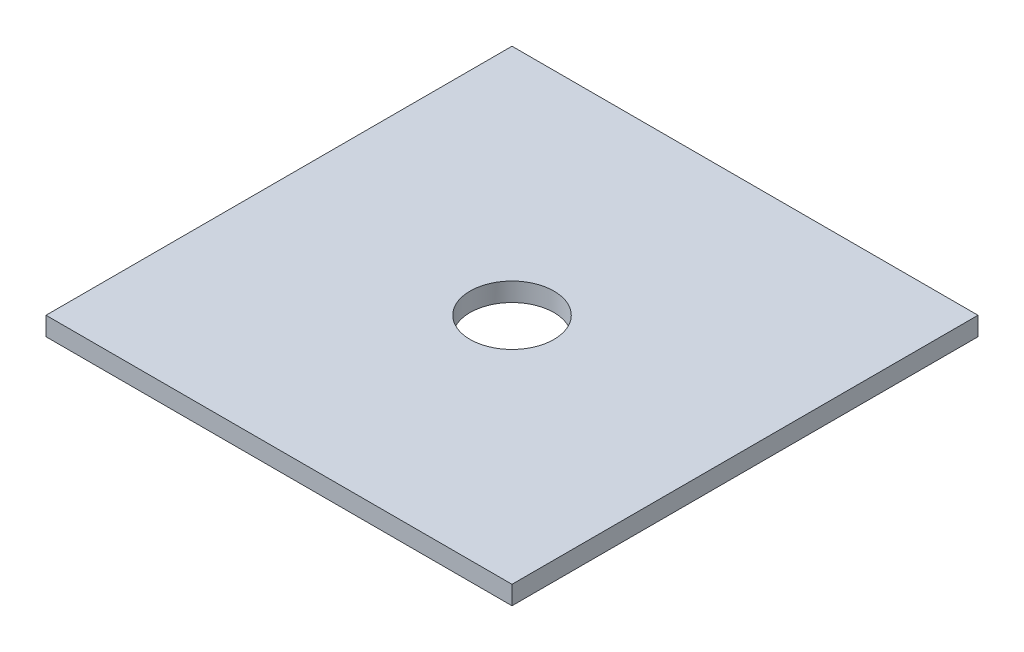
ISO-10303-21;
HEADER;
FILE_DESCRIPTION(('STEP AP214'),'2;1');
FILE_NAME('part.step','',(''),(''),'','','');
FILE_SCHEMA(('AUTOMOTIVE_DESIGN { 1 0 10303 214 1 1 1 1 }'));
ENDSEC;
DATA;
#1=APPLICATION_CONTEXT('core data for automotive mechanical design processes');
#2=APPLICATION_PROTOCOL_DEFINITION('international standard','automotive_design',2000,#1);
#3=PRODUCT_CONTEXT('',#1,'mechanical');
#4=PRODUCT('Part','Part','',(#3));
#5=PRODUCT_RELATED_PRODUCT_CATEGORY('part','',(#4));
#6=PRODUCT_DEFINITION_FORMATION('','',#4);
#7=PRODUCT_DEFINITION_CONTEXT('part definition',#1,'design');
#8=PRODUCT_DEFINITION('design','',#6,#7);
#9=PRODUCT_DEFINITION_SHAPE('','',#8);
#10=(LENGTH_UNIT() NAMED_UNIT(*) SI_UNIT(.MILLI.,.METRE.));
#11=(NAMED_UNIT(*) PLANE_ANGLE_UNIT() SI_UNIT($,.RADIAN.));
#12=(NAMED_UNIT(*) SI_UNIT($,.STERADIAN.) SOLID_ANGLE_UNIT());
#13=UNCERTAINTY_MEASURE_WITH_UNIT(LENGTH_MEASURE(1.E-05),#10,'distance_accuracy_value','');
#14=(GEOMETRIC_REPRESENTATION_CONTEXT(3) GLOBAL_UNCERTAINTY_ASSIGNED_CONTEXT((#13)) GLOBAL_UNIT_ASSIGNED_CONTEXT((#10,
#11,#12)) REPRESENTATION_CONTEXT('',''));
#15=CARTESIAN_POINT('',(0.,0.,0.));
#16=DIRECTION('',(0.,0.,1.));
#17=DIRECTION('',(1.,0.,0.));
#18=AXIS2_PLACEMENT_3D('',#15,#16,#17);
#19=CARTESIAN_POINT('',(-25.,2.,-25.));
#20=DIRECTION('',(1.,0.,0.));
#21=DIRECTION('',(0.,0.,-1.));
#22=AXIS2_PLACEMENT_3D('',#19,#20,#21);
#23=PLANE('',#22);
#24=DIRECTION('',(0.,0.,1.));
#25=VECTOR('',#24,1.);
#26=CARTESIAN_POINT('',(-25.,0.,-25.));
#27=LINE('',#26,#25);
#28=CARTESIAN_POINT('',(-25.,0.,-25.));
#29=VERTEX_POINT('',#28);
#30=CARTESIAN_POINT('',(-25.,0.,25.));
#31=VERTEX_POINT('',#30);
#32=EDGE_CURVE('E98',#29,#31,#27,.T.);
#33=ORIENTED_EDGE('',*,*,#32,.T.);
#34=DIRECTION('',(0.,-1.,0.));
#35=VECTOR('',#34,1.);
#36=CARTESIAN_POINT('',(-25.,2.,25.));
#37=LINE('',#36,#35);
#38=CARTESIAN_POINT('',(-25.,2.,25.));
#39=VERTEX_POINT('',#38);
#40=EDGE_CURVE('E11',#39,#31,#37,.T.);
#41=ORIENTED_EDGE('',*,*,#40,.F.);
#42=DIRECTION('',(0.,0.,1.));
#43=VECTOR('',#42,1.);
#44=CARTESIAN_POINT('',(-25.,2.,-25.));
#45=LINE('',#44,#43);
#46=CARTESIAN_POINT('',(-25.,2.,-25.));
#47=VERTEX_POINT('',#46);
#48=EDGE_CURVE('E86',#47,#39,#45,.T.);
#49=ORIENTED_EDGE('',*,*,#48,.F.);
#50=DIRECTION('',(0.,-1.,0.));
#51=VECTOR('',#50,1.);
#52=CARTESIAN_POINT('',(-25.,2.,-25.));
#53=LINE('',#52,#51);
#54=EDGE_CURVE('E94',#47,#29,#53,.T.);
#55=ORIENTED_EDGE('',*,*,#54,.T.);
#56=EDGE_LOOP('',(#33,#41,#49,#55));
#57=FACE_BOUND('',#56,.T.);
#58=ADVANCED_FACE('F35',(#57),#23,.F.);
#59=CARTESIAN_POINT('',(25.,2.,25.));
#60=DIRECTION('',(0.,0.,-1.));
#61=DIRECTION('',(-1.,0.,0.));
#62=AXIS2_PLACEMENT_3D('',#59,#60,#61);
#63=PLANE('',#62);
#64=DIRECTION('',(1.,0.,0.));
#65=VECTOR('',#64,1.);
#66=CARTESIAN_POINT('',(25.,0.,25.));
#67=LINE('',#66,#65);
#68=CARTESIAN_POINT('',(25.,0.,25.));
#69=VERTEX_POINT('',#68);
#70=EDGE_CURVE('E90',#31,#69,#67,.T.);
#71=ORIENTED_EDGE('',*,*,#70,.T.);
#72=DIRECTION('',(0.,-1.,0.));
#73=VECTOR('',#72,1.);
#74=CARTESIAN_POINT('',(25.,2.,25.));
#75=LINE('',#74,#73);
#76=CARTESIAN_POINT('',(25.,2.,25.));
#77=VERTEX_POINT('',#76);
#78=EDGE_CURVE('E43',#77,#69,#75,.T.);
#79=ORIENTED_EDGE('',*,*,#78,.F.);
#80=DIRECTION('',(1.,0.,0.));
#81=VECTOR('',#80,1.);
#82=CARTESIAN_POINT('',(25.,2.,25.));
#83=LINE('',#82,#81);
#84=EDGE_CURVE('E81',#39,#77,#83,.T.);
#85=ORIENTED_EDGE('',*,*,#84,.F.);
#86=ORIENTED_EDGE('',*,*,#40,.T.);
#87=EDGE_LOOP('',(#71,#79,#85,#86));
#88=FACE_BOUND('',#87,.T.);
#89=ADVANCED_FACE('F89',(#88),#63,.F.);
#90=CARTESIAN_POINT('',(25.,2.,-25.));
#91=DIRECTION('',(-1.,0.,0.));
#92=DIRECTION('',(0.,0.,1.));
#93=AXIS2_PLACEMENT_3D('',#90,#91,#92);
#94=PLANE('',#93);
#95=DIRECTION('',(0.,0.,-1.));
#96=VECTOR('',#95,1.);
#97=CARTESIAN_POINT('',(25.,0.,-25.));
#98=LINE('',#97,#96);
#99=CARTESIAN_POINT('',(25.,0.,-25.));
#100=VERTEX_POINT('',#99);
#101=EDGE_CURVE('E68',#69,#100,#98,.T.);
#102=ORIENTED_EDGE('',*,*,#101,.T.);
#103=DIRECTION('',(0.,-1.,0.));
#104=VECTOR('',#103,1.);
#105=CARTESIAN_POINT('',(25.,2.,-25.));
#106=LINE('',#105,#104);
#107=CARTESIAN_POINT('',(25.,2.,-25.));
#108=VERTEX_POINT('',#107);
#109=EDGE_CURVE('E91',#108,#100,#106,.T.);
#110=ORIENTED_EDGE('',*,*,#109,.F.);
#111=DIRECTION('',(0.,0.,-1.));
#112=VECTOR('',#111,1.);
#113=CARTESIAN_POINT('',(25.,2.,-25.));
#114=LINE('',#113,#112);
#115=EDGE_CURVE('E84',#77,#108,#114,.T.);
#116=ORIENTED_EDGE('',*,*,#115,.F.);
#117=ORIENTED_EDGE('',*,*,#78,.T.);
#118=EDGE_LOOP('',(#102,#110,#116,#117));
#119=FACE_BOUND('',#118,.T.);
#120=ADVANCED_FACE('F92',(#119),#94,.F.);
#121=CARTESIAN_POINT('',(25.,2.,-25.));
#122=DIRECTION('',(0.,0.,1.));
#123=DIRECTION('',(1.,0.,0.));
#124=AXIS2_PLACEMENT_3D('',#121,#122,#123);
#125=PLANE('',#124);
#126=DIRECTION('',(-1.,0.,0.));
#127=VECTOR('',#126,1.);
#128=CARTESIAN_POINT('',(25.,0.,-25.));
#129=LINE('',#128,#127);
#130=EDGE_CURVE('E74',#100,#29,#129,.T.);
#131=ORIENTED_EDGE('',*,*,#130,.T.);
#132=ORIENTED_EDGE('',*,*,#54,.F.);
#133=DIRECTION('',(-1.,0.,0.));
#134=VECTOR('',#133,1.);
#135=CARTESIAN_POINT('',(25.,2.,-25.));
#136=LINE('',#135,#134);
#137=EDGE_CURVE('E51',#108,#47,#136,.T.);
#138=ORIENTED_EDGE('',*,*,#137,.F.);
#139=ORIENTED_EDGE('',*,*,#109,.T.);
#140=EDGE_LOOP('',(#131,#132,#138,#139));
#141=FACE_BOUND('',#140,.T.);
#142=ADVANCED_FACE('F106',(#141),#125,.F.);
#143=CARTESIAN_POINT('',(0.,2.,0.));
#144=DIRECTION('',(0.,-1.,0.));
#145=DIRECTION('',(0.,0.,-1.));
#146=AXIS2_PLACEMENT_3D('',#143,#144,#145);
#147=PLANE('',#146);
#148=CARTESIAN_POINT('',(0.,2.,0.));
#149=DIRECTION('',(0.,1.,0.));
#150=DIRECTION('',(0.,0.,1.));
#151=AXIS2_PLACEMENT_3D('',#148,#149,#150);
#152=CIRCLE('',#151,4.49999999999999);
#153=CARTESIAN_POINT('',(0.,2.,4.49999999999999));
#154=VERTEX_POINT('',#153);
#155=EDGE_CURVE('E114',#154,#154,#152,.T.);
#156=ORIENTED_EDGE('',*,*,#155,.F.);
#157=EDGE_LOOP('',(#156));
#158=FACE_BOUND('',#157,.T.);
#159=ORIENTED_EDGE('',*,*,#48,.T.);
#160=ORIENTED_EDGE('',*,*,#84,.T.);
#161=ORIENTED_EDGE('',*,*,#115,.T.);
#162=ORIENTED_EDGE('',*,*,#137,.T.);
#163=EDGE_LOOP('',(#159,#160,#161,#162));
#164=FACE_BOUND('',#163,.T.);
#165=ADVANCED_FACE('F82',(#158,#164),#147,.F.);
#166=CARTESIAN_POINT('',(0.,0.,0.));
#167=DIRECTION('',(0.,-1.,0.));
#168=DIRECTION('',(0.,0.,-1.));
#169=AXIS2_PLACEMENT_3D('',#166,#167,#168);
#170=PLANE('',#169);
#171=CARTESIAN_POINT('',(0.,0.,0.));
#172=DIRECTION('',(0.,-1.,0.));
#173=DIRECTION('',(0.,0.,-1.));
#174=AXIS2_PLACEMENT_3D('',#171,#172,#173);
#175=CIRCLE('',#174,4.49999999999999);
#176=CARTESIAN_POINT('',(0.,0.,-4.49999999999999));
#177=VERTEX_POINT('',#176);
#178=EDGE_CURVE('E101',#177,#177,#175,.T.);
#179=ORIENTED_EDGE('',*,*,#178,.F.);
#180=EDGE_LOOP('',(#179));
#181=FACE_BOUND('',#180,.T.);
#182=ORIENTED_EDGE('',*,*,#32,.F.);
#183=ORIENTED_EDGE('',*,*,#130,.F.);
#184=ORIENTED_EDGE('',*,*,#101,.F.);
#185=ORIENTED_EDGE('',*,*,#70,.F.);
#186=EDGE_LOOP('',(#182,#183,#184,#185));
#187=FACE_BOUND('',#186,.T.);
#188=ADVANCED_FACE('F109',(#181,#187),#170,.T.);
#189=CARTESIAN_POINT('',(0.,2.,0.));
#190=DIRECTION('',(0.,1.,0.));
#191=DIRECTION('',(0.,0.,1.));
#192=AXIS2_PLACEMENT_3D('',#189,#190,#191);
#193=CYLINDRICAL_SURFACE('',#192,4.49999999999999);
#194=ORIENTED_EDGE('',*,*,#178,.T.);
#195=EDGE_LOOP('',(#194));
#196=FACE_BOUND('',#195,.T.);
#197=ORIENTED_EDGE('',*,*,#155,.T.);
#198=EDGE_LOOP('',(#197));
#199=FACE_BOUND('',#198,.T.);
#200=ADVANCED_FACE('F118',(#196,#199),#193,.F.);
#201=CLOSED_SHELL('',(#58,#89,#120,#142,#165,#188,#200));
#202=MANIFOLD_SOLID_BREP('B2',#201);
#203=ADVANCED_BREP_SHAPE_REPRESENTATION('',(#18,#202),#14);
#204=SHAPE_DEFINITION_REPRESENTATION(#9,#203);
ENDSEC;
END-ISO-10303-21;
